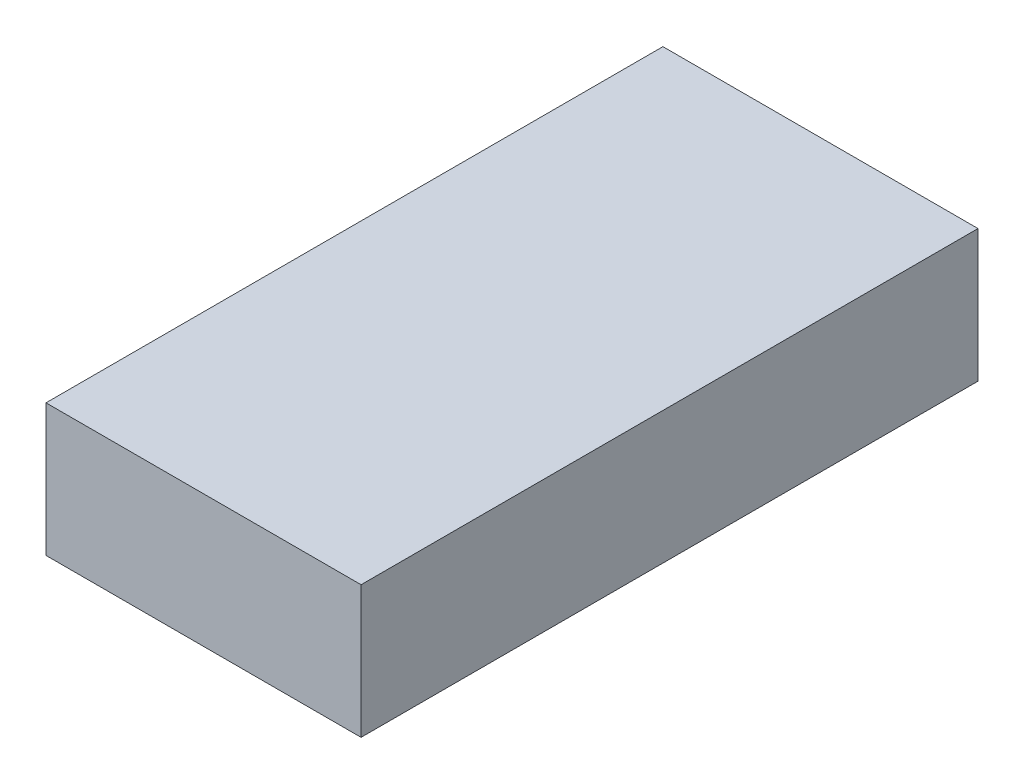
ISO-10303-21;
HEADER;
FILE_DESCRIPTION(('STEP AP214'),'2;1');
FILE_NAME('part.step','',(''),(''),'','','');
FILE_SCHEMA(('AUTOMOTIVE_DESIGN { 1 0 10303 214 1 1 1 1 }'));
ENDSEC;
DATA;
#1=APPLICATION_CONTEXT('core data for automotive mechanical design processes');
#2=APPLICATION_PROTOCOL_DEFINITION('international standard','automotive_design',2000,#1);
#3=PRODUCT_CONTEXT('',#1,'mechanical');
#4=PRODUCT('Part','Part','',(#3));
#5=PRODUCT_RELATED_PRODUCT_CATEGORY('part','',(#4));
#6=PRODUCT_DEFINITION_FORMATION('','',#4);
#7=PRODUCT_DEFINITION_CONTEXT('part definition',#1,'design');
#8=PRODUCT_DEFINITION('design','',#6,#7);
#9=PRODUCT_DEFINITION_SHAPE('','',#8);
#10=(LENGTH_UNIT() NAMED_UNIT(*) SI_UNIT(.MILLI.,.METRE.));
#11=(NAMED_UNIT(*) PLANE_ANGLE_UNIT() SI_UNIT($,.RADIAN.));
#12=(NAMED_UNIT(*) SI_UNIT($,.STERADIAN.) SOLID_ANGLE_UNIT());
#13=UNCERTAINTY_MEASURE_WITH_UNIT(LENGTH_MEASURE(1.E-05),#10,'distance_accuracy_value','');
#14=(GEOMETRIC_REPRESENTATION_CONTEXT(3) GLOBAL_UNCERTAINTY_ASSIGNED_CONTEXT((#13)) GLOBAL_UNIT_ASSIGNED_CONTEXT((#10,
#11,#12)) REPRESENTATION_CONTEXT('',''));
#15=CARTESIAN_POINT('',(0.,0.,0.));
#16=DIRECTION('',(0.,0.,1.));
#17=DIRECTION('',(1.,0.,0.));
#18=AXIS2_PLACEMENT_3D('',#15,#16,#17);
#19=CARTESIAN_POINT('',(5.65,4.,0.));
#20=DIRECTION('',(1.,0.,0.));
#21=DIRECTION('',(0.,0.,-1.));
#22=AXIS2_PLACEMENT_3D('',#19,#20,#21);
#23=PLANE('',#22);
#24=DIRECTION('',(0.,0.,1.));
#25=VECTOR('',#24,1.);
#26=CARTESIAN_POINT('',(5.65,0.,0.));
#27=LINE('',#26,#25);
#28=CARTESIAN_POINT('',(5.65,0.,-14.));
#29=VERTEX_POINT('',#28);
#30=CARTESIAN_POINT('',(5.65,0.,12.5));
#31=VERTEX_POINT('',#30);
#32=EDGE_CURVE('E156',#29,#31,#27,.T.);
#33=ORIENTED_EDGE('',*,*,#32,.T.);
#34=DIRECTION('',(0.,-1.,0.));
#35=VECTOR('',#34,1.);
#36=CARTESIAN_POINT('',(5.65,4.,12.5));
#37=LINE('',#36,#35);
#38=CARTESIAN_POINT('',(5.65,4.,12.5));
#39=VERTEX_POINT('',#38);
#40=EDGE_CURVE('E55',#39,#31,#37,.T.);
#41=ORIENTED_EDGE('',*,*,#40,.F.);
#42=DIRECTION('',(0.,0.,1.));
#43=VECTOR('',#42,1.);
#44=CARTESIAN_POINT('',(5.65,4.,0.));
#45=LINE('',#44,#43);
#46=CARTESIAN_POINT('',(5.65,4.,-14.));
#47=VERTEX_POINT('',#46);
#48=EDGE_CURVE('E123',#47,#39,#45,.T.);
#49=ORIENTED_EDGE('',*,*,#48,.F.);
#50=DIRECTION('',(0.,-1.,0.));
#51=VECTOR('',#50,1.);
#52=CARTESIAN_POINT('',(5.65,4.,-14.));
#53=LINE('',#52,#51);
#54=EDGE_CURVE('E11',#47,#29,#53,.T.);
#55=ORIENTED_EDGE('',*,*,#54,.T.);
#56=EDGE_LOOP('',(#33,#41,#49,#55));
#57=FACE_BOUND('',#56,.T.);
#58=ADVANCED_FACE('F46',(#57),#23,.F.);
#59=CARTESIAN_POINT('',(0.,4.,12.5));
#60=DIRECTION('',(0.,0.,1.));
#61=DIRECTION('',(1.,0.,0.));
#62=AXIS2_PLACEMENT_3D('',#59,#60,#61);
#63=PLANE('',#62);
#64=DIRECTION('',(-1.,0.,0.));
#65=VECTOR('',#64,1.);
#66=CARTESIAN_POINT('',(0.,0.,12.5));
#67=LINE('',#66,#65);
#68=CARTESIAN_POINT('',(-5.65,0.,12.5));
#69=VERTEX_POINT('',#68);
#70=EDGE_CURVE('E152',#31,#69,#67,.T.);
#71=ORIENTED_EDGE('',*,*,#70,.T.);
#72=DIRECTION('',(0.,-1.,0.));
#73=VECTOR('',#72,1.);
#74=CARTESIAN_POINT('',(-5.65,4.,12.5));
#75=LINE('',#74,#73);
#76=CARTESIAN_POINT('',(-5.65,4.,12.5));
#77=VERTEX_POINT('',#76);
#78=EDGE_CURVE('E143',#77,#69,#75,.T.);
#79=ORIENTED_EDGE('',*,*,#78,.F.);
#80=DIRECTION('',(-1.,0.,0.));
#81=VECTOR('',#80,1.);
#82=CARTESIAN_POINT('',(0.,4.,12.5));
#83=LINE('',#82,#81);
#84=EDGE_CURVE('E62',#39,#77,#83,.T.);
#85=ORIENTED_EDGE('',*,*,#84,.F.);
#86=ORIENTED_EDGE('',*,*,#40,.T.);
#87=EDGE_LOOP('',(#71,#79,#85,#86));
#88=FACE_BOUND('',#87,.T.);
#89=ADVANCED_FACE('F151',(#88),#63,.F.);
#90=CARTESIAN_POINT('',(-5.65,4.,0.));
#91=DIRECTION('',(1.,0.,0.));
#92=DIRECTION('',(0.,0.,-1.));
#93=AXIS2_PLACEMENT_3D('',#90,#91,#92);
#94=PLANE('',#93);
#95=DIRECTION('',(0.,0.,1.));
#96=VECTOR('',#95,1.);
#97=CARTESIAN_POINT('',(-5.65,0.,0.));
#98=LINE('',#97,#96);
#99=CARTESIAN_POINT('',(-5.65,0.,-14.));
#100=VERTEX_POINT('',#99);
#101=EDGE_CURVE('E159',#100,#69,#98,.T.);
#102=ORIENTED_EDGE('',*,*,#101,.F.);
#103=DIRECTION('',(0.,-1.,0.));
#104=VECTOR('',#103,1.);
#105=CARTESIAN_POINT('',(-5.65,4.,-14.));
#106=LINE('',#105,#104);
#107=CARTESIAN_POINT('',(-5.65,4.,-14.));
#108=VERTEX_POINT('',#107);
#109=EDGE_CURVE('E140',#108,#100,#106,.T.);
#110=ORIENTED_EDGE('',*,*,#109,.F.);
#111=DIRECTION('',(0.,0.,1.));
#112=VECTOR('',#111,1.);
#113=CARTESIAN_POINT('',(-5.65,4.,0.));
#114=LINE('',#113,#112);
#115=EDGE_CURVE('E132',#108,#77,#114,.T.);
#116=ORIENTED_EDGE('',*,*,#115,.T.);
#117=ORIENTED_EDGE('',*,*,#78,.T.);
#118=EDGE_LOOP('',(#102,#110,#116,#117));
#119=FACE_BOUND('',#118,.T.);
#120=ADVANCED_FACE('F200',(#119),#94,.T.);
#121=CARTESIAN_POINT('',(0.,4.,-14.));
#122=DIRECTION('',(0.,0.,1.));
#123=DIRECTION('',(1.,0.,0.));
#124=AXIS2_PLACEMENT_3D('',#121,#122,#123);
#125=PLANE('',#124);
#126=DIRECTION('',(-1.,0.,0.));
#127=VECTOR('',#126,1.);
#128=CARTESIAN_POINT('',(0.,0.,-14.));
#129=LINE('',#128,#127);
#130=CARTESIAN_POINT('',(-7.15,0.,-14.));
#131=VERTEX_POINT('',#130);
#132=EDGE_CURVE('E164',#100,#131,#129,.T.);
#133=ORIENTED_EDGE('',*,*,#132,.T.);
#134=DIRECTION('',(0.,-1.,0.));
#135=VECTOR('',#134,1.);
#136=CARTESIAN_POINT('',(-7.15,4.,-14.));
#137=LINE('',#136,#135);
#138=CARTESIAN_POINT('',(-7.15,6.,-14.));
#139=VERTEX_POINT('',#138);
#140=EDGE_CURVE('E136',#139,#131,#137,.T.);
#141=ORIENTED_EDGE('',*,*,#140,.F.);
#142=DIRECTION('',(-1.,0.,0.));
#143=VECTOR('',#142,1.);
#144=CARTESIAN_POINT('',(-7.15,6.,-14.));
#145=LINE('',#144,#143);
#146=CARTESIAN_POINT('',(7.15,6.,-14.));
#147=VERTEX_POINT('',#146);
#148=EDGE_CURVE('E177',#147,#139,#145,.T.);
#149=ORIENTED_EDGE('',*,*,#148,.F.);
#150=DIRECTION('',(0.,-1.,0.));
#151=VECTOR('',#150,1.);
#152=CARTESIAN_POINT('',(7.15,4.,-14.));
#153=LINE('',#152,#151);
#154=CARTESIAN_POINT('',(7.15,0.,-14.));
#155=VERTEX_POINT('',#154);
#156=EDGE_CURVE('E106',#147,#155,#153,.T.);
#157=ORIENTED_EDGE('',*,*,#156,.T.);
#158=EDGE_CURVE('E121',#155,#29,#129,.T.);
#159=ORIENTED_EDGE('',*,*,#158,.T.);
#160=ORIENTED_EDGE('',*,*,#54,.F.);
#161=DIRECTION('',(-1.,0.,0.));
#162=VECTOR('',#161,1.);
#163=CARTESIAN_POINT('',(-7.15,4.,-14.));
#164=LINE('',#163,#162);
#165=EDGE_CURVE('E192',#47,#108,#164,.T.);
#166=ORIENTED_EDGE('',*,*,#165,.T.);
#167=ORIENTED_EDGE('',*,*,#109,.T.);
#168=EDGE_LOOP('',(#133,#141,#149,#157,#159,#160,#166,#167));
#169=FACE_BOUND('',#168,.T.);
#170=ADVANCED_FACE('F205',(#169),#125,.F.);
#171=CARTESIAN_POINT('',(-7.15,4.,0.));
#172=DIRECTION('',(1.,0.,0.));
#173=DIRECTION('',(0.,0.,-1.));
#174=AXIS2_PLACEMENT_3D('',#171,#172,#173);
#175=PLANE('',#174);
#176=DIRECTION('',(0.,0.,1.));
#177=VECTOR('',#176,1.);
#178=CARTESIAN_POINT('',(-7.15,0.,0.));
#179=LINE('',#178,#177);
#180=CARTESIAN_POINT('',(-7.15,0.,14.));
#181=VERTEX_POINT('',#180);
#182=EDGE_CURVE('E116',#131,#181,#179,.T.);
#183=ORIENTED_EDGE('',*,*,#182,.T.);
#184=DIRECTION('',(0.,-1.,0.));
#185=VECTOR('',#184,1.);
#186=CARTESIAN_POINT('',(-7.15,4.,14.));
#187=LINE('',#186,#185);
#188=CARTESIAN_POINT('',(-7.15,6.,14.));
#189=VERTEX_POINT('',#188);
#190=EDGE_CURVE('E105',#189,#181,#187,.T.);
#191=ORIENTED_EDGE('',*,*,#190,.F.);
#192=DIRECTION('',(0.,0.,1.));
#193=VECTOR('',#192,1.);
#194=CARTESIAN_POINT('',(-7.15,6.,-14.));
#195=LINE('',#194,#193);
#196=EDGE_CURVE('E194',#139,#189,#195,.T.);
#197=ORIENTED_EDGE('',*,*,#196,.F.);
#198=ORIENTED_EDGE('',*,*,#140,.T.);
#199=EDGE_LOOP('',(#183,#191,#197,#198));
#200=FACE_BOUND('',#199,.T.);
#201=ADVANCED_FACE('F218',(#200),#175,.F.);
#202=CARTESIAN_POINT('',(0.,4.,14.));
#203=DIRECTION('',(0.,0.,1.));
#204=DIRECTION('',(1.,0.,0.));
#205=AXIS2_PLACEMENT_3D('',#202,#203,#204);
#206=PLANE('',#205);
#207=DIRECTION('',(-1.,0.,0.));
#208=VECTOR('',#207,1.);
#209=CARTESIAN_POINT('',(0.,0.,14.));
#210=LINE('',#209,#208);
#211=CARTESIAN_POINT('',(7.15,0.,14.));
#212=VERTEX_POINT('',#211);
#213=EDGE_CURVE('E109',#212,#181,#210,.T.);
#214=ORIENTED_EDGE('',*,*,#213,.F.);
#215=DIRECTION('',(0.,-1.,0.));
#216=VECTOR('',#215,1.);
#217=CARTESIAN_POINT('',(7.15,4.,14.));
#218=LINE('',#217,#216);
#219=CARTESIAN_POINT('',(7.15,6.,14.));
#220=VERTEX_POINT('',#219);
#221=EDGE_CURVE('E92',#220,#212,#218,.T.);
#222=ORIENTED_EDGE('',*,*,#221,.F.);
#223=DIRECTION('',(1.,0.,0.));
#224=VECTOR('',#223,1.);
#225=CARTESIAN_POINT('',(-7.15,6.,14.));
#226=LINE('',#225,#224);
#227=EDGE_CURVE('E188',#189,#220,#226,.T.);
#228=ORIENTED_EDGE('',*,*,#227,.F.);
#229=ORIENTED_EDGE('',*,*,#190,.T.);
#230=EDGE_LOOP('',(#214,#222,#228,#229));
#231=FACE_BOUND('',#230,.T.);
#232=ADVANCED_FACE('F110',(#231),#206,.T.);
#233=CARTESIAN_POINT('',(7.15,4.,0.));
#234=DIRECTION('',(1.,0.,0.));
#235=DIRECTION('',(0.,0.,-1.));
#236=AXIS2_PLACEMENT_3D('',#233,#234,#235);
#237=PLANE('',#236);
#238=DIRECTION('',(0.,0.,1.));
#239=VECTOR('',#238,1.);
#240=CARTESIAN_POINT('',(7.15,0.,0.));
#241=LINE('',#240,#239);
#242=EDGE_CURVE('E97',#155,#212,#241,.T.);
#243=ORIENTED_EDGE('',*,*,#242,.F.);
#244=ORIENTED_EDGE('',*,*,#156,.F.);
#245=DIRECTION('',(0.,0.,-1.));
#246=VECTOR('',#245,1.);
#247=CARTESIAN_POINT('',(7.15,6.,-14.));
#248=LINE('',#247,#246);
#249=EDGE_CURVE('E100',#220,#147,#248,.T.);
#250=ORIENTED_EDGE('',*,*,#249,.F.);
#251=ORIENTED_EDGE('',*,*,#221,.T.);
#252=EDGE_LOOP('',(#243,#244,#250,#251));
#253=FACE_BOUND('',#252,.T.);
#254=ADVANCED_FACE('F94',(#253),#237,.T.);
#255=CARTESIAN_POINT('',(0.,0.,0.));
#256=DIRECTION('',(0.,1.,0.));
#257=DIRECTION('',(0.,0.,1.));
#258=AXIS2_PLACEMENT_3D('',#255,#256,#257);
#259=PLANE('',#258);
#260=ORIENTED_EDGE('',*,*,#158,.F.);
#261=ORIENTED_EDGE('',*,*,#242,.T.);
#262=ORIENTED_EDGE('',*,*,#213,.T.);
#263=ORIENTED_EDGE('',*,*,#182,.F.);
#264=ORIENTED_EDGE('',*,*,#132,.F.);
#265=ORIENTED_EDGE('',*,*,#101,.T.);
#266=ORIENTED_EDGE('',*,*,#70,.F.);
#267=ORIENTED_EDGE('',*,*,#32,.F.);
#268=EDGE_LOOP('',(#260,#261,#262,#263,#264,#265,#266,#267));
#269=FACE_BOUND('',#268,.T.);
#270=ADVANCED_FACE('F119',(#269),#259,.F.);
#271=CARTESIAN_POINT('',(0.,4.,0.));
#272=DIRECTION('',(0.,1.,0.));
#273=DIRECTION('',(0.,0.,1.));
#274=AXIS2_PLACEMENT_3D('',#271,#272,#273);
#275=PLANE('',#274);
#276=ORIENTED_EDGE('',*,*,#165,.F.);
#277=ORIENTED_EDGE('',*,*,#48,.T.);
#278=ORIENTED_EDGE('',*,*,#84,.T.);
#279=ORIENTED_EDGE('',*,*,#115,.F.);
#280=EDGE_LOOP('',(#276,#277,#278,#279));
#281=FACE_BOUND('',#280,.T.);
#282=ADVANCED_FACE('F203',(#281),#275,.F.);
#283=CARTESIAN_POINT('',(0.,6.,0.));
#284=DIRECTION('',(0.,1.,0.));
#285=DIRECTION('',(0.,0.,1.));
#286=AXIS2_PLACEMENT_3D('',#283,#284,#285);
#287=PLANE('',#286);
#288=ORIENTED_EDGE('',*,*,#196,.T.);
#289=ORIENTED_EDGE('',*,*,#227,.T.);
#290=ORIENTED_EDGE('',*,*,#249,.T.);
#291=ORIENTED_EDGE('',*,*,#148,.T.);
#292=EDGE_LOOP('',(#288,#289,#290,#291));
#293=FACE_BOUND('',#292,.T.);
#294=ADVANCED_FACE('F229',(#293),#287,.T.);
#295=CLOSED_SHELL('',(#58,#89,#120,#170,#201,#232,#254,#270,#282,#294));
#296=MANIFOLD_SOLID_BREP('B2',#295);
#297=ADVANCED_BREP_SHAPE_REPRESENTATION('',(#18,#296),#14);
#298=SHAPE_DEFINITION_REPRESENTATION(#9,#297);
ENDSEC;
END-ISO-10303-21;
